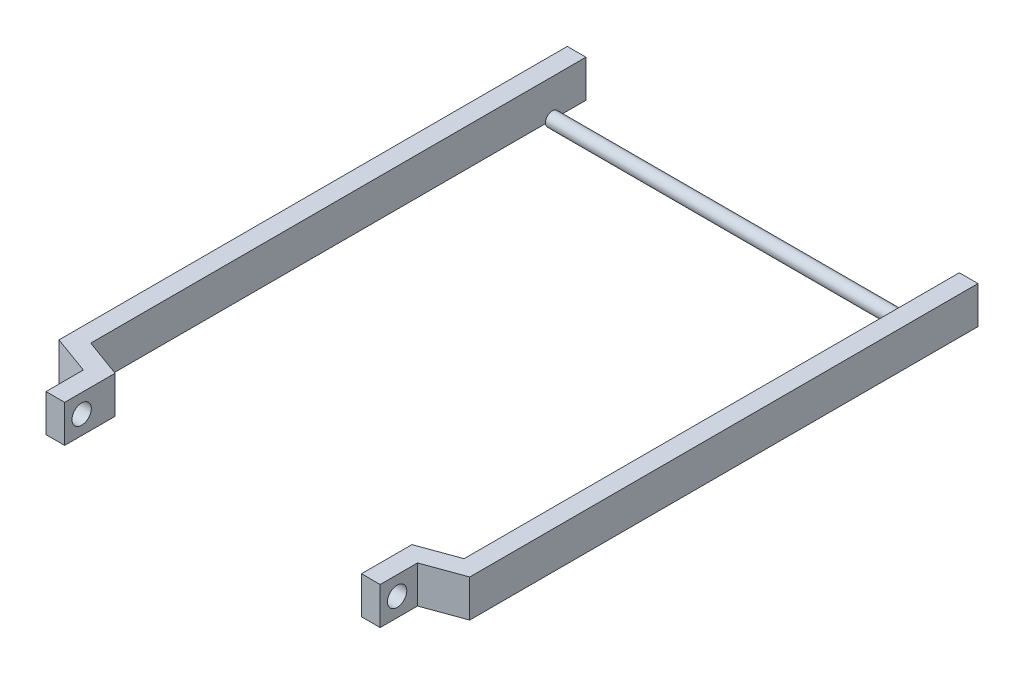
ISO-10303-21;
HEADER;
FILE_DESCRIPTION(('STEP AP214'),'2;1');
FILE_NAME('part.step','',(''),(''),'','','');
FILE_SCHEMA(('AUTOMOTIVE_DESIGN { 1 0 10303 214 1 1 1 1 }'));
ENDSEC;
DATA;
#1=APPLICATION_CONTEXT('core data for automotive mechanical design processes');
#2=APPLICATION_PROTOCOL_DEFINITION('international standard','automotive_design',2000,#1);
#3=PRODUCT_CONTEXT('',#1,'mechanical');
#4=PRODUCT('Part','Part','',(#3));
#5=PRODUCT_RELATED_PRODUCT_CATEGORY('part','',(#4));
#6=PRODUCT_DEFINITION_FORMATION('','',#4);
#7=PRODUCT_DEFINITION_CONTEXT('part definition',#1,'design');
#8=PRODUCT_DEFINITION('design','',#6,#7);
#9=PRODUCT_DEFINITION_SHAPE('','',#8);
#10=(LENGTH_UNIT() NAMED_UNIT(*) SI_UNIT(.MILLI.,.METRE.));
#11=(NAMED_UNIT(*) PLANE_ANGLE_UNIT() SI_UNIT($,.RADIAN.));
#12=(NAMED_UNIT(*) SI_UNIT($,.STERADIAN.) SOLID_ANGLE_UNIT());
#13=UNCERTAINTY_MEASURE_WITH_UNIT(LENGTH_MEASURE(1.E-05),#10,'distance_accuracy_value','');
#14=(GEOMETRIC_REPRESENTATION_CONTEXT(3) GLOBAL_UNCERTAINTY_ASSIGNED_CONTEXT((#13)) GLOBAL_UNIT_ASSIGNED_CONTEXT((#10,
#11,#12)) REPRESENTATION_CONTEXT('',''));
#15=CARTESIAN_POINT('',(0.,0.,0.));
#16=DIRECTION('',(0.,0.,1.));
#17=DIRECTION('',(1.,0.,0.));
#18=AXIS2_PLACEMENT_3D('',#15,#16,#17);
#19=CARTESIAN_POINT('',(-179.,40.,70.4038086206276));
#20=DIRECTION('',(1.,0.,0.));
#21=DIRECTION('',(0.,1.,0.));
#22=AXIS2_PLACEMENT_3D('',#19,#20,#21);
#23=PLANE('',#22);
#24=CARTESIAN_POINT('',(-179.,20.,92.2251137006805));
#25=DIRECTION('',(-1.,0.,0.));
#26=DIRECTION('',(0.,0.,1.));
#27=AXIS2_PLACEMENT_3D('',#24,#25,#26);
#28=CIRCLE('',#27,10.3434411603419);
#29=CARTESIAN_POINT('',(-179.,20.,102.568554861022));
#30=VERTEX_POINT('',#29);
#31=EDGE_CURVE('E168',#30,#30,#28,.T.);
#32=ORIENTED_EDGE('',*,*,#31,.F.);
#33=EDGE_LOOP('',(#32));
#34=FACE_BOUND('',#33,.T.);
#35=DIRECTION('',(0.,1.,0.));
#36=VECTOR('',#35,1.);
#37=CARTESIAN_POINT('',(-179.,40.,110.403808620628));
#38=LINE('',#37,#36);
#39=CARTESIAN_POINT('',(-179.,0.,110.403808620628));
#40=VERTEX_POINT('',#39);
#41=CARTESIAN_POINT('',(-179.,40.,110.403808620628));
#42=VERTEX_POINT('',#41);
#43=EDGE_CURVE('E12',#40,#42,#38,.T.);
#44=ORIENTED_EDGE('',*,*,#43,.T.);
#45=DIRECTION('',(0.,0.,1.));
#46=VECTOR('',#45,1.);
#47=CARTESIAN_POINT('',(-179.,40.,0.));
#48=LINE('',#47,#46);
#49=CARTESIAN_POINT('',(-179.,40.,70.4038086206276));
#50=VERTEX_POINT('',#49);
#51=EDGE_CURVE('E148',#50,#42,#48,.T.);
#52=ORIENTED_EDGE('',*,*,#51,.F.);
#53=DIRECTION('',(0.,-1.,0.));
#54=VECTOR('',#53,1.);
#55=CARTESIAN_POINT('',(-179.,40.,70.4038086206276));
#56=LINE('',#55,#54);
#57=CARTESIAN_POINT('',(-179.,0.,70.4038086206276));
#58=VERTEX_POINT('',#57);
#59=EDGE_CURVE('E213',#50,#58,#56,.T.);
#60=ORIENTED_EDGE('',*,*,#59,.T.);
#61=DIRECTION('',(0.,0.,1.));
#62=VECTOR('',#61,1.);
#63=CARTESIAN_POINT('',(-179.,0.,0.));
#64=LINE('',#63,#62);
#65=EDGE_CURVE('E206',#58,#40,#64,.T.);
#66=ORIENTED_EDGE('',*,*,#65,.T.);
#67=EDGE_LOOP('',(#44,#52,#60,#66));
#68=FACE_BOUND('',#67,.T.);
#69=ADVANCED_FACE('F57',(#34,#68),#23,.F.);
#70=CARTESIAN_POINT('',(-179.,40.,110.403808620628));
#71=DIRECTION('',(0.,0.,-1.));
#72=DIRECTION('',(0.,-1.,0.));
#73=AXIS2_PLACEMENT_3D('',#70,#71,#72);
#74=PLANE('',#73);
#75=DIRECTION('',(0.,1.,0.));
#76=VECTOR('',#75,1.);
#77=CARTESIAN_POINT('',(-159.,40.,110.403808620628));
#78=LINE('',#77,#76);
#79=CARTESIAN_POINT('',(-159.,0.,110.403808620628));
#80=VERTEX_POINT('',#79);
#81=CARTESIAN_POINT('',(-159.,40.,110.403808620628));
#82=VERTEX_POINT('',#81);
#83=EDGE_CURVE('E66',#80,#82,#78,.T.);
#84=ORIENTED_EDGE('',*,*,#83,.T.);
#85=DIRECTION('',(1.,0.,0.));
#86=VECTOR('',#85,1.);
#87=CARTESIAN_POINT('',(0.,40.,110.403808620628));
#88=LINE('',#87,#86);
#89=EDGE_CURVE('E200',#42,#82,#88,.T.);
#90=ORIENTED_EDGE('',*,*,#89,.F.);
#91=ORIENTED_EDGE('',*,*,#43,.F.);
#92=DIRECTION('',(1.,0.,0.));
#93=VECTOR('',#92,1.);
#94=CARTESIAN_POINT('',(0.,0.,110.403808620628));
#95=LINE('',#94,#93);
#96=EDGE_CURVE('E194',#40,#80,#95,.T.);
#97=ORIENTED_EDGE('',*,*,#96,.T.);
#98=EDGE_LOOP('',(#84,#90,#91,#97));
#99=FACE_BOUND('',#98,.T.);
#100=ADVANCED_FACE('F59',(#99),#74,.F.);
#101=CARTESIAN_POINT('',(-159.,40.,110.403808620628));
#102=DIRECTION('',(-1.,0.,0.));
#103=DIRECTION('',(0.,1.,0.));
#104=AXIS2_PLACEMENT_3D('',#101,#102,#103);
#105=PLANE('',#104);
#106=CARTESIAN_POINT('',(-159.,20.,92.2251137006804));
#107=DIRECTION('',(1.,0.,0.));
#108=DIRECTION('',(0.,0.,1.));
#109=AXIS2_PLACEMENT_3D('',#106,#107,#108);
#110=CIRCLE('',#109,10.3434411603419);
#111=CARTESIAN_POINT('',(-159.,20.,102.568554861022));
#112=VERTEX_POINT('',#111);
#113=EDGE_CURVE('E163',#112,#112,#110,.T.);
#114=ORIENTED_EDGE('',*,*,#113,.F.);
#115=EDGE_LOOP('',(#114));
#116=FACE_BOUND('',#115,.T.);
#117=DIRECTION('',(0.,1.,0.));
#118=VECTOR('',#117,1.);
#119=CARTESIAN_POINT('',(-159.,40.,56.3996578564334));
#120=LINE('',#119,#118);
#121=CARTESIAN_POINT('',(-159.,0.,56.3996578564334));
#122=VERTEX_POINT('',#121);
#123=CARTESIAN_POINT('',(-159.,40.,56.3996578564334));
#124=VERTEX_POINT('',#123);
#125=EDGE_CURVE('E228',#122,#124,#120,.T.);
#126=ORIENTED_EDGE('',*,*,#125,.T.);
#127=DIRECTION('',(0.,0.,-1.));
#128=VECTOR('',#127,1.);
#129=CARTESIAN_POINT('',(-159.,40.,0.));
#130=LINE('',#129,#128);
#131=EDGE_CURVE('E222',#82,#124,#130,.T.);
#132=ORIENTED_EDGE('',*,*,#131,.F.);
#133=ORIENTED_EDGE('',*,*,#83,.F.);
#134=DIRECTION('',(0.,0.,-1.));
#135=VECTOR('',#134,1.);
#136=CARTESIAN_POINT('',(-159.,0.,0.));
#137=LINE('',#136,#135);
#138=EDGE_CURVE('E184',#80,#122,#137,.T.);
#139=ORIENTED_EDGE('',*,*,#138,.T.);
#140=EDGE_LOOP('',(#126,#132,#133,#139));
#141=FACE_BOUND('',#140,.T.);
#142=ADVANCED_FACE('F266',(#116,#141),#105,.F.);
#143=CARTESIAN_POINT('',(-159.,40.,56.3996578564334));
#144=DIRECTION('',(-0.342020143325665,0.,0.939692620785909));
#145=DIRECTION('',(0.,1.,0.));
#146=AXIS2_PLACEMENT_3D('',#143,#144,#145);
#147=PLANE('',#146);
#148=DIRECTION('',(0.,1.,0.));
#149=VECTOR('',#148,1.);
#150=CARTESIAN_POINT('',(-200.,40.,41.4768782515192));
#151=LINE('',#150,#149);
#152=CARTESIAN_POINT('',(-200.,0.,41.4768782515192));
#153=VERTEX_POINT('',#152);
#154=CARTESIAN_POINT('',(-200.,40.,41.4768782515192));
#155=VERTEX_POINT('',#154);
#156=EDGE_CURVE('E225',#153,#155,#151,.T.);
#157=ORIENTED_EDGE('',*,*,#156,.T.);
#158=DIRECTION('',(-0.93969262078591,0.,-0.342020143325665));
#159=VECTOR('',#158,1.);
#160=CARTESIAN_POINT('',(-159.,40.,56.3996578564334));
#161=LINE('',#160,#159);
#162=EDGE_CURVE('E144',#124,#155,#161,.T.);
#163=ORIENTED_EDGE('',*,*,#162,.F.);
#164=ORIENTED_EDGE('',*,*,#125,.F.);
#165=DIRECTION('',(-0.93969262078591,0.,-0.342020143325665));
#166=VECTOR('',#165,1.);
#167=CARTESIAN_POINT('',(-159.,0.,56.3996578564334));
#168=LINE('',#167,#166);
#169=EDGE_CURVE('E181',#122,#153,#168,.T.);
#170=ORIENTED_EDGE('',*,*,#169,.T.);
#171=EDGE_LOOP('',(#157,#163,#164,#170));
#172=FACE_BOUND('',#171,.T.);
#173=ADVANCED_FACE('F271',(#172),#147,.F.);
#174=CARTESIAN_POINT('',(-200.,40.,41.4768782515192));
#175=DIRECTION('',(-1.,0.,0.));
#176=DIRECTION('',(0.,0.,1.));
#177=AXIS2_PLACEMENT_3D('',#174,#175,#176);
#178=PLANE('',#177);
#179=DIRECTION('',(0.,0.,-1.));
#180=VECTOR('',#179,1.);
#181=CARTESIAN_POINT('',(-200.,0.,0.));
#182=LINE('',#181,#180);
#183=CARTESIAN_POINT('',(-200.,0.,-489.071592309949));
#184=VERTEX_POINT('',#183);
#185=EDGE_CURVE('E161',#153,#184,#182,.T.);
#186=ORIENTED_EDGE('',*,*,#185,.T.);
#187=DIRECTION('',(0.,-1.,0.));
#188=VECTOR('',#187,1.);
#189=CARTESIAN_POINT('',(-200.,40.,-489.071592309949));
#190=LINE('',#189,#188);
#191=CARTESIAN_POINT('',(-200.,40.,-489.071592309949));
#192=VERTEX_POINT('',#191);
#193=EDGE_CURVE('E155',#192,#184,#190,.T.);
#194=ORIENTED_EDGE('',*,*,#193,.F.);
#195=DIRECTION('',(0.,0.,-1.));
#196=VECTOR('',#195,1.);
#197=CARTESIAN_POINT('',(-200.,40.,0.));
#198=LINE('',#197,#196);
#199=EDGE_CURVE('E138',#155,#192,#198,.T.);
#200=ORIENTED_EDGE('',*,*,#199,.F.);
#201=ORIENTED_EDGE('',*,*,#156,.F.);
#202=EDGE_LOOP('',(#186,#194,#200,#201));
#203=FACE_BOUND('',#202,.T.);
#204=ADVANCED_FACE('F159',(#203),#178,.F.);
#205=CARTESIAN_POINT('',(0.,40.,0.));
#206=DIRECTION('',(0.,1.,0.));
#207=DIRECTION('',(1.,0.,0.));
#208=AXIS2_PLACEMENT_3D('',#205,#206,#207);
#209=PLANE('',#208);
#210=ORIENTED_EDGE('',*,*,#199,.T.);
#211=DIRECTION('',(1.,0.,0.));
#212=VECTOR('',#211,1.);
#213=CARTESIAN_POINT('',(-200.,40.,-489.071592309949));
#214=LINE('',#213,#212);
#215=CARTESIAN_POINT('',(-220.,40.,-489.071592309949));
#216=VERTEX_POINT('',#215);
#217=EDGE_CURVE('E141',#216,#192,#214,.T.);
#218=ORIENTED_EDGE('',*,*,#217,.F.);
#219=DIRECTION('',(0.,0.,1.));
#220=VECTOR('',#219,1.);
#221=CARTESIAN_POINT('',(-220.,40.,-449.596191379372));
#222=LINE('',#221,#220);
#223=CARTESIAN_POINT('',(-220.,40.,55.4810290157135));
#224=VERTEX_POINT('',#223);
#225=EDGE_CURVE('E173',#216,#224,#222,.T.);
#226=ORIENTED_EDGE('',*,*,#225,.T.);
#227=DIRECTION('',(0.93969262078591,0.,0.342020143325665));
#228=VECTOR('',#227,1.);
#229=CARTESIAN_POINT('',(-220.,40.,55.4810290157135));
#230=LINE('',#229,#228);
#231=EDGE_CURVE('E203',#224,#50,#230,.T.);
#232=ORIENTED_EDGE('',*,*,#231,.T.);
#233=ORIENTED_EDGE('',*,*,#51,.T.);
#234=ORIENTED_EDGE('',*,*,#89,.T.);
#235=ORIENTED_EDGE('',*,*,#131,.T.);
#236=ORIENTED_EDGE('',*,*,#162,.T.);
#237=EDGE_LOOP('',(#210,#218,#226,#232,#233,#234,#235,#236));
#238=FACE_BOUND('',#237,.T.);
#239=ADVANCED_FACE('F140',(#238),#209,.T.);
#240=CARTESIAN_POINT('',(-220.,40.,55.4810290157135));
#241=DIRECTION('',(0.342020143325665,0.,-0.93969262078591));
#242=DIRECTION('',(0.,-1.,0.));
#243=AXIS2_PLACEMENT_3D('',#240,#241,#242);
#244=PLANE('',#243);
#245=ORIENTED_EDGE('',*,*,#59,.F.);
#246=ORIENTED_EDGE('',*,*,#231,.F.);
#247=DIRECTION('',(0.,-1.,0.));
#248=VECTOR('',#247,1.);
#249=CARTESIAN_POINT('',(-220.,40.,55.4810290157136));
#250=LINE('',#249,#248);
#251=CARTESIAN_POINT('',(-220.,0.,55.4810290157135));
#252=VERTEX_POINT('',#251);
#253=EDGE_CURVE('E177',#224,#252,#250,.T.);
#254=ORIENTED_EDGE('',*,*,#253,.T.);
#255=DIRECTION('',(0.93969262078591,0.,0.342020143325665));
#256=VECTOR('',#255,1.);
#257=CARTESIAN_POINT('',(-220.,0.,55.4810290157135));
#258=LINE('',#257,#256);
#259=EDGE_CURVE('E209',#252,#58,#258,.T.);
#260=ORIENTED_EDGE('',*,*,#259,.T.);
#261=EDGE_LOOP('',(#245,#246,#254,#260));
#262=FACE_BOUND('',#261,.T.);
#263=ADVANCED_FACE('F247',(#262),#244,.F.);
#264=CARTESIAN_POINT('',(0.,0.,0.));
#265=DIRECTION('',(0.,1.,0.));
#266=DIRECTION('',(1.,0.,0.));
#267=AXIS2_PLACEMENT_3D('',#264,#265,#266);
#268=PLANE('',#267);
#269=DIRECTION('',(0.,0.,-1.));
#270=VECTOR('',#269,1.);
#271=CARTESIAN_POINT('',(-220.,0.,-449.596191379372));
#272=LINE('',#271,#270);
#273=CARTESIAN_POINT('',(-220.,0.,-489.071592309949));
#274=VERTEX_POINT('',#273);
#275=EDGE_CURVE('E176',#252,#274,#272,.T.);
#276=ORIENTED_EDGE('',*,*,#275,.T.);
#277=DIRECTION('',(-1.,0.,0.));
#278=VECTOR('',#277,1.);
#279=CARTESIAN_POINT('',(-200.,0.,-489.071592309949));
#280=LINE('',#279,#278);
#281=EDGE_CURVE('E164',#184,#274,#280,.T.);
#282=ORIENTED_EDGE('',*,*,#281,.F.);
#283=ORIENTED_EDGE('',*,*,#185,.F.);
#284=ORIENTED_EDGE('',*,*,#169,.F.);
#285=ORIENTED_EDGE('',*,*,#138,.F.);
#286=ORIENTED_EDGE('',*,*,#96,.F.);
#287=ORIENTED_EDGE('',*,*,#65,.F.);
#288=ORIENTED_EDGE('',*,*,#259,.F.);
#289=EDGE_LOOP('',(#276,#282,#283,#284,#285,#286,#287,#288));
#290=FACE_BOUND('',#289,.T.);
#291=ADVANCED_FACE('F241',(#290),#268,.F.);
#292=CARTESIAN_POINT('',(-220.,40.,-449.596191379372));
#293=DIRECTION('',(1.,0.,0.));
#294=DIRECTION('',(0.,0.,-1.));
#295=AXIS2_PLACEMENT_3D('',#292,#293,#294);
#296=PLANE('',#295);
#297=ORIENTED_EDGE('',*,*,#225,.F.);
#298=DIRECTION('',(0.,1.,0.));
#299=VECTOR('',#298,1.);
#300=CARTESIAN_POINT('',(-220.,40.,-489.071592309949));
#301=LINE('',#300,#299);
#302=EDGE_CURVE('E157',#274,#216,#301,.T.);
#303=ORIENTED_EDGE('',*,*,#302,.F.);
#304=ORIENTED_EDGE('',*,*,#275,.F.);
#305=ORIENTED_EDGE('',*,*,#253,.F.);
#306=EDGE_LOOP('',(#297,#303,#304,#305));
#307=FACE_BOUND('',#306,.T.);
#308=ADVANCED_FACE('F246',(#307),#296,.F.);
#309=CARTESIAN_POINT('',(248.,20.,92.2251137006804));
#310=DIRECTION('',(-1.,0.,0.));
#311=DIRECTION('',(0.,0.,1.));
#312=AXIS2_PLACEMENT_3D('',#309,#310,#311);
#313=CYLINDRICAL_SURFACE('',#312,10.3434411603419);
#314=ORIENTED_EDGE('',*,*,#31,.T.);
#315=EDGE_LOOP('',(#314));
#316=FACE_BOUND('',#315,.T.);
#317=ORIENTED_EDGE('',*,*,#113,.T.);
#318=EDGE_LOOP('',(#317));
#319=FACE_BOUND('',#318,.T.);
#320=ADVANCED_FACE('F256',(#316,#319),#313,.F.);
#321=CARTESIAN_POINT('',(0.,0.,-489.071592309949));
#322=DIRECTION('',(0.,0.,-1.));
#323=DIRECTION('',(-1.,0.,0.));
#324=AXIS2_PLACEMENT_3D('',#321,#322,#323);
#325=PLANE('',#324);
#326=ORIENTED_EDGE('',*,*,#193,.T.);
#327=ORIENTED_EDGE('',*,*,#281,.T.);
#328=ORIENTED_EDGE('',*,*,#302,.T.);
#329=ORIENTED_EDGE('',*,*,#217,.T.);
#330=EDGE_LOOP('',(#326,#327,#328,#329));
#331=FACE_BOUND('',#330,.T.);
#332=ADVANCED_FACE('F153',(#331),#325,.T.);
#333=CLOSED_SHELL('',(#69,#100,#142,#173,#204,#239,#263,#291,#308,#320,#332));
#334=MANIFOLD_SOLID_BREP('B2',#333);
#335=CARTESIAN_POINT('',(200.,40.,41.4768782515192));
#336=DIRECTION('',(1.,0.,0.));
#337=DIRECTION('',(0.,1.,0.));
#338=AXIS2_PLACEMENT_3D('',#335,#336,#337);
#339=PLANE('',#338);
#340=CARTESIAN_POINT('',(200.,2.90200286857897,-450.955888488416));
#341=DIRECTION('',(-1.,0.,0.));
#342=DIRECTION('',(0.,0.,1.));
#343=AXIS2_PLACEMENT_3D('',#340,#341,#342);
#344=CIRCLE('',#343,7.3522689366653);
#345=CARTESIAN_POINT('',(200.,0.,-444.200576662319));
#346=VERTEX_POINT('',#345);
#347=CARTESIAN_POINT('',(200.,0.,-457.711200314514));
#348=VERTEX_POINT('',#347);
#349=EDGE_CURVE('E602',#346,#348,#344,.T.);
#350=ORIENTED_EDGE('',*,*,#349,.F.);
#351=DIRECTION('',(0.,0.,-1.));
#352=VECTOR('',#351,1.);
#353=CARTESIAN_POINT('',(200.,0.,0.));
#354=LINE('',#353,#352);
#355=CARTESIAN_POINT('',(200.,0.,41.4768782515192));
#356=VERTEX_POINT('',#355);
#357=EDGE_CURVE('E596',#356,#346,#354,.T.);
#358=ORIENTED_EDGE('',*,*,#357,.F.);
#359=DIRECTION('',(0.,1.,0.));
#360=VECTOR('',#359,1.);
#361=CARTESIAN_POINT('',(200.,40.,41.4768782515192));
#362=LINE('',#361,#360);
#363=CARTESIAN_POINT('',(200.,40.,41.4768782515192));
#364=VERTEX_POINT('',#363);
#365=EDGE_CURVE('E643',#356,#364,#362,.T.);
#366=ORIENTED_EDGE('',*,*,#365,.T.);
#367=DIRECTION('',(0.,0.,-1.));
#368=VECTOR('',#367,1.);
#369=CARTESIAN_POINT('',(200.,40.,0.));
#370=LINE('',#369,#368);
#371=CARTESIAN_POINT('',(200.,40.,-489.071592309949));
#372=VERTEX_POINT('',#371);
#373=EDGE_CURVE('E657',#364,#372,#370,.T.);
#374=ORIENTED_EDGE('',*,*,#373,.T.);
#375=DIRECTION('',(0.,1.,0.));
#376=VECTOR('',#375,1.);
#377=CARTESIAN_POINT('',(200.,40.,-489.071592309949));
#378=LINE('',#377,#376);
#379=CARTESIAN_POINT('',(200.,0.,-489.071592309949));
#380=VERTEX_POINT('',#379);
#381=EDGE_CURVE('E720',#380,#372,#378,.T.);
#382=ORIENTED_EDGE('',*,*,#381,.F.);
#383=EDGE_CURVE('E597',#348,#380,#354,.T.);
#384=ORIENTED_EDGE('',*,*,#383,.F.);
#385=EDGE_LOOP('',(#350,#358,#366,#374,#382,#384));
#386=FACE_BOUND('',#385,.T.);
#387=ADVANCED_FACE('F506',(#386),#339,.F.);
#388=CARTESIAN_POINT('',(179.,40.,70.4038086206276));
#389=DIRECTION('',(-1.,0.,0.));
#390=DIRECTION('',(0.,0.,1.));
#391=AXIS2_PLACEMENT_3D('',#388,#389,#390);
#392=PLANE('',#391);
#393=CARTESIAN_POINT('',(179.,20.,92.2251137006804));
#394=DIRECTION('',(1.,0.,0.));
#395=DIRECTION('',(0.,0.,1.));
#396=AXIS2_PLACEMENT_3D('',#393,#394,#395);
#397=CIRCLE('',#396,10.3434411603419);
#398=CARTESIAN_POINT('',(179.,20.,102.568554861022));
#399=VERTEX_POINT('',#398);
#400=EDGE_CURVE('E711',#399,#399,#397,.T.);
#401=ORIENTED_EDGE('',*,*,#400,.F.);
#402=EDGE_LOOP('',(#401));
#403=FACE_BOUND('',#402,.T.);
#404=DIRECTION('',(0.,1.,0.));
#405=VECTOR('',#404,1.);
#406=CARTESIAN_POINT('',(179.,40.,70.4038086206276));
#407=LINE('',#406,#405);
#408=CARTESIAN_POINT('',(179.,0.,70.4038086206276));
#409=VERTEX_POINT('',#408);
#410=CARTESIAN_POINT('',(179.,40.,70.4038086206276));
#411=VERTEX_POINT('',#410);
#412=EDGE_CURVE('E534',#409,#411,#407,.T.);
#413=ORIENTED_EDGE('',*,*,#412,.T.);
#414=DIRECTION('',(0.,0.,1.));
#415=VECTOR('',#414,1.);
#416=CARTESIAN_POINT('',(179.,40.,0.));
#417=LINE('',#416,#415);
#418=CARTESIAN_POINT('',(179.,40.,110.403808620628));
#419=VERTEX_POINT('',#418);
#420=EDGE_CURVE('E672',#411,#419,#417,.T.);
#421=ORIENTED_EDGE('',*,*,#420,.T.);
#422=DIRECTION('',(0.,-1.,0.));
#423=VECTOR('',#422,1.);
#424=CARTESIAN_POINT('',(179.,40.,110.403808620628));
#425=LINE('',#424,#423);
#426=CARTESIAN_POINT('',(179.,0.,110.403808620628));
#427=VERTEX_POINT('',#426);
#428=EDGE_CURVE('E55',#419,#427,#425,.T.);
#429=ORIENTED_EDGE('',*,*,#428,.T.);
#430=DIRECTION('',(0.,0.,1.));
#431=VECTOR('',#430,1.);
#432=CARTESIAN_POINT('',(179.,0.,0.));
#433=LINE('',#432,#431);
#434=EDGE_CURVE('E621',#409,#427,#433,.T.);
#435=ORIENTED_EDGE('',*,*,#434,.F.);
#436=EDGE_LOOP('',(#413,#421,#429,#435));
#437=FACE_BOUND('',#436,.T.);
#438=ADVANCED_FACE('F508',(#403,#437),#392,.F.);
#439=CARTESIAN_POINT('',(179.,40.,110.403808620628));
#440=DIRECTION('',(0.,0.,-1.));
#441=DIRECTION('',(0.,-1.,0.));
#442=AXIS2_PLACEMENT_3D('',#439,#440,#441);
#443=PLANE('',#442);
#444=ORIENTED_EDGE('',*,*,#428,.F.);
#445=DIRECTION('',(-1.,0.,0.));
#446=VECTOR('',#445,1.);
#447=CARTESIAN_POINT('',(0.,40.,110.403808620628));
#448=LINE('',#447,#446);
#449=CARTESIAN_POINT('',(159.,40.,110.403808620628));
#450=VERTEX_POINT('',#449);
#451=EDGE_CURVE('E668',#419,#450,#448,.T.);
#452=ORIENTED_EDGE('',*,*,#451,.T.);
#453=DIRECTION('',(0.,-1.,0.));
#454=VECTOR('',#453,1.);
#455=CARTESIAN_POINT('',(159.,40.,110.403808620628));
#456=LINE('',#455,#454);
#457=CARTESIAN_POINT('',(159.,0.,110.403808620628));
#458=VERTEX_POINT('',#457);
#459=EDGE_CURVE('E515',#450,#458,#456,.T.);
#460=ORIENTED_EDGE('',*,*,#459,.T.);
#461=DIRECTION('',(-1.,0.,0.));
#462=VECTOR('',#461,1.);
#463=CARTESIAN_POINT('',(0.,0.,110.403808620628));
#464=LINE('',#463,#462);
#465=EDGE_CURVE('E652',#427,#458,#464,.T.);
#466=ORIENTED_EDGE('',*,*,#465,.F.);
#467=EDGE_LOOP('',(#444,#452,#460,#466));
#468=FACE_BOUND('',#467,.T.);
#469=ADVANCED_FACE('F699',(#468),#443,.F.);
#470=CARTESIAN_POINT('',(159.,40.,110.403808620628));
#471=DIRECTION('',(1.,0.,0.));
#472=DIRECTION('',(0.,0.,1.));
#473=AXIS2_PLACEMENT_3D('',#470,#471,#472);
#474=PLANE('',#473);
#475=CARTESIAN_POINT('',(159.,20.,92.2251137006804));
#476=DIRECTION('',(-1.,0.,0.));
#477=DIRECTION('',(0.,0.,1.));
#478=AXIS2_PLACEMENT_3D('',#475,#476,#477);
#479=CIRCLE('',#478,10.3434411603419);
#480=CARTESIAN_POINT('',(159.,20.,102.568554861022));
#481=VERTEX_POINT('',#480);
#482=EDGE_CURVE('E640',#481,#481,#479,.T.);
#483=ORIENTED_EDGE('',*,*,#482,.F.);
#484=EDGE_LOOP('',(#483));
#485=FACE_BOUND('',#484,.T.);
#486=ORIENTED_EDGE('',*,*,#459,.F.);
#487=DIRECTION('',(0.,0.,-1.));
#488=VECTOR('',#487,1.);
#489=CARTESIAN_POINT('',(159.,40.,0.));
#490=LINE('',#489,#488);
#491=CARTESIAN_POINT('',(159.,40.,56.3996578564334));
#492=VERTEX_POINT('',#491);
#493=EDGE_CURVE('E664',#450,#492,#490,.T.);
#494=ORIENTED_EDGE('',*,*,#493,.T.);
#495=DIRECTION('',(0.,-1.,0.));
#496=VECTOR('',#495,1.);
#497=CARTESIAN_POINT('',(159.,40.,56.3996578564334));
#498=LINE('',#497,#496);
#499=CARTESIAN_POINT('',(159.,0.,56.3996578564334));
#500=VERTEX_POINT('',#499);
#501=EDGE_CURVE('E677',#492,#500,#498,.T.);
#502=ORIENTED_EDGE('',*,*,#501,.T.);
#503=DIRECTION('',(0.,0.,-1.));
#504=VECTOR('',#503,1.);
#505=CARTESIAN_POINT('',(159.,0.,0.));
#506=LINE('',#505,#504);
#507=EDGE_CURVE('E629',#458,#500,#506,.T.);
#508=ORIENTED_EDGE('',*,*,#507,.F.);
#509=EDGE_LOOP('',(#486,#494,#502,#508));
#510=FACE_BOUND('',#509,.T.);
#511=ADVANCED_FACE('F695',(#485,#510),#474,.F.);
#512=CARTESIAN_POINT('',(159.,40.,56.3996578564334));
#513=DIRECTION('',(0.342020143325665,0.,0.939692620785909));
#514=DIRECTION('',(0.,-1.,0.));
#515=AXIS2_PLACEMENT_3D('',#512,#513,#514);
#516=PLANE('',#515);
#517=ORIENTED_EDGE('',*,*,#501,.F.);
#518=DIRECTION('',(0.93969262078591,0.,-0.342020143325665));
#519=VECTOR('',#518,1.);
#520=CARTESIAN_POINT('',(159.,40.,56.3996578564334));
#521=LINE('',#520,#519);
#522=EDGE_CURVE('E656',#492,#364,#521,.T.);
#523=ORIENTED_EDGE('',*,*,#522,.T.);
#524=ORIENTED_EDGE('',*,*,#365,.F.);
#525=DIRECTION('',(0.93969262078591,0.,-0.342020143325665));
#526=VECTOR('',#525,1.);
#527=CARTESIAN_POINT('',(159.,0.,56.3996578564334));
#528=LINE('',#527,#526);
#529=EDGE_CURVE('E613',#500,#356,#528,.T.);
#530=ORIENTED_EDGE('',*,*,#529,.F.);
#531=EDGE_LOOP('',(#517,#523,#524,#530));
#532=FACE_BOUND('',#531,.T.);
#533=ADVANCED_FACE('F692',(#532),#516,.F.);
#534=CARTESIAN_POINT('',(220.,40.,55.4810290157135));
#535=DIRECTION('',(-0.342020143325665,0.,-0.93969262078591));
#536=DIRECTION('',(-0.93969262078591,0.,0.342020143325665));
#537=AXIS2_PLACEMENT_3D('',#534,#535,#536);
#538=PLANE('',#537);
#539=DIRECTION('',(0.,1.,0.));
#540=VECTOR('',#539,1.);
#541=CARTESIAN_POINT('',(220.,40.,55.4810290157136));
#542=LINE('',#541,#540);
#543=CARTESIAN_POINT('',(220.,0.,55.4810290157135));
#544=VERTEX_POINT('',#543);
#545=CARTESIAN_POINT('',(220.,40.,55.4810290157135));
#546=VERTEX_POINT('',#545);
#547=EDGE_CURVE('E644',#544,#546,#542,.T.);
#548=ORIENTED_EDGE('',*,*,#547,.T.);
#549=DIRECTION('',(-0.93969262078591,0.,0.342020143325665));
#550=VECTOR('',#549,1.);
#551=CARTESIAN_POINT('',(220.,40.,55.4810290157135));
#552=LINE('',#551,#550);
#553=EDGE_CURVE('E660',#546,#411,#552,.T.);
#554=ORIENTED_EDGE('',*,*,#553,.T.);
#555=ORIENTED_EDGE('',*,*,#412,.F.);
#556=DIRECTION('',(-0.93969262078591,0.,0.342020143325665));
#557=VECTOR('',#556,1.);
#558=CARTESIAN_POINT('',(220.,0.,55.4810290157135));
#559=LINE('',#558,#557);
#560=EDGE_CURVE('E615',#544,#409,#559,.T.);
#561=ORIENTED_EDGE('',*,*,#560,.F.);
#562=EDGE_LOOP('',(#548,#554,#555,#561));
#563=FACE_BOUND('',#562,.T.);
#564=ADVANCED_FACE('F823',(#563),#538,.F.);
#565=CARTESIAN_POINT('',(0.,40.,0.));
#566=DIRECTION('',(0.,-1.,0.));
#567=DIRECTION('',(0.,0.,-1.));
#568=AXIS2_PLACEMENT_3D('',#565,#566,#567);
#569=PLANE('',#568);
#570=DIRECTION('',(0.,0.,-1.));
#571=VECTOR('',#570,1.);
#572=CARTESIAN_POINT('',(220.,40.,-449.596191379372));
#573=LINE('',#572,#571);
#574=CARTESIAN_POINT('',(220.,40.,-489.071592309949));
#575=VERTEX_POINT('',#574);
#576=EDGE_CURVE('E647',#546,#575,#573,.T.);
#577=ORIENTED_EDGE('',*,*,#576,.T.);
#578=DIRECTION('',(1.,0.,0.));
#579=VECTOR('',#578,1.);
#580=CARTESIAN_POINT('',(220.,40.,-489.071592309949));
#581=LINE('',#580,#579);
#582=EDGE_CURVE('E691',#372,#575,#581,.T.);
#583=ORIENTED_EDGE('',*,*,#582,.F.);
#584=ORIENTED_EDGE('',*,*,#373,.F.);
#585=ORIENTED_EDGE('',*,*,#522,.F.);
#586=ORIENTED_EDGE('',*,*,#493,.F.);
#587=ORIENTED_EDGE('',*,*,#451,.F.);
#588=ORIENTED_EDGE('',*,*,#420,.F.);
#589=ORIENTED_EDGE('',*,*,#553,.F.);
#590=EDGE_LOOP('',(#577,#583,#584,#585,#586,#587,#588,#589));
#591=FACE_BOUND('',#590,.T.);
#592=ADVANCED_FACE('F688',(#591),#569,.F.);
#593=CARTESIAN_POINT('',(0.,0.,0.));
#594=DIRECTION('',(0.,-1.,0.));
#595=DIRECTION('',(0.,0.,-1.));
#596=AXIS2_PLACEMENT_3D('',#593,#594,#595);
#597=PLANE('',#596);
#598=ORIENTED_EDGE('',*,*,#357,.T.);
#599=EDGE_CURVE('E591',#346,#348,#354,.T.);
#600=ORIENTED_EDGE('',*,*,#599,.T.);
#601=ORIENTED_EDGE('',*,*,#383,.T.);
#602=DIRECTION('',(-1.,0.,0.));
#603=VECTOR('',#602,1.);
#604=CARTESIAN_POINT('',(220.,0.,-489.071592309949));
#605=LINE('',#604,#603);
#606=CARTESIAN_POINT('',(220.,0.,-489.071592309949));
#607=VERTEX_POINT('',#606);
#608=EDGE_CURVE('E989',#607,#380,#605,.T.);
#609=ORIENTED_EDGE('',*,*,#608,.F.);
#610=DIRECTION('',(0.,0.,1.));
#611=VECTOR('',#610,1.);
#612=CARTESIAN_POINT('',(220.,0.,-449.596191379372));
#613=LINE('',#612,#611);
#614=EDGE_CURVE('E636',#607,#544,#613,.T.);
#615=ORIENTED_EDGE('',*,*,#614,.T.);
#616=ORIENTED_EDGE('',*,*,#560,.T.);
#617=ORIENTED_EDGE('',*,*,#434,.T.);
#618=ORIENTED_EDGE('',*,*,#465,.T.);
#619=ORIENTED_EDGE('',*,*,#507,.T.);
#620=ORIENTED_EDGE('',*,*,#529,.T.);
#621=EDGE_LOOP('',(#598,#600,#601,#609,#615,#616,#617,#618,#619,#620));
#622=FACE_BOUND('',#621,.T.);
#623=ADVANCED_FACE('F610',(#622),#597,.T.);
#624=CARTESIAN_POINT('',(220.,40.,-449.596191379372));
#625=DIRECTION('',(-1.,0.,0.));
#626=DIRECTION('',(0.,0.,1.));
#627=AXIS2_PLACEMENT_3D('',#624,#625,#626);
#628=PLANE('',#627);
#629=ORIENTED_EDGE('',*,*,#614,.F.);
#630=DIRECTION('',(0.,-1.,0.));
#631=VECTOR('',#630,1.);
#632=CARTESIAN_POINT('',(220.,40.,-489.071592309949));
#633=LINE('',#632,#631);
#634=EDGE_CURVE('E986',#575,#607,#633,.T.);
#635=ORIENTED_EDGE('',*,*,#634,.F.);
#636=ORIENTED_EDGE('',*,*,#576,.F.);
#637=ORIENTED_EDGE('',*,*,#547,.F.);
#638=EDGE_LOOP('',(#629,#635,#636,#637));
#639=FACE_BOUND('',#638,.T.);
#640=ADVANCED_FACE('F740',(#639),#628,.F.);
#641=CARTESIAN_POINT('',(248.,20.,92.2251137006804));
#642=DIRECTION('',(-1.,0.,0.));
#643=DIRECTION('',(0.,0.,1.));
#644=AXIS2_PLACEMENT_3D('',#641,#642,#643);
#645=CYLINDRICAL_SURFACE('',#644,10.3434411603419);
#646=ORIENTED_EDGE('',*,*,#482,.T.);
#647=EDGE_LOOP('',(#646));
#648=FACE_BOUND('',#647,.T.);
#649=ORIENTED_EDGE('',*,*,#400,.T.);
#650=EDGE_LOOP('',(#649));
#651=FACE_BOUND('',#650,.T.);
#652=ADVANCED_FACE('F734',(#648,#651),#645,.F.);
#653=CARTESIAN_POINT('',(0.,0.,-489.071592309949));
#654=DIRECTION('',(0.,0.,-1.));
#655=DIRECTION('',(-1.,0.,0.));
#656=AXIS2_PLACEMENT_3D('',#653,#654,#655);
#657=PLANE('',#656);
#658=ORIENTED_EDGE('',*,*,#634,.T.);
#659=ORIENTED_EDGE('',*,*,#608,.T.);
#660=ORIENTED_EDGE('',*,*,#381,.T.);
#661=ORIENTED_EDGE('',*,*,#582,.T.);
#662=EDGE_LOOP('',(#658,#659,#660,#661));
#663=FACE_BOUND('',#662,.T.);
#664=ADVANCED_FACE('F739',(#663),#657,.T.);
#665=CARTESIAN_POINT('',(-198.,2.90200286857897,-450.955888488416));
#666=DIRECTION('',(1.,0.,0.));
#667=DIRECTION('',(0.,0.,-1.));
#668=AXIS2_PLACEMENT_3D('',#665,#666,#667);
#669=CYLINDRICAL_SURFACE('',#668,7.3522689366653);
#670=CARTESIAN_POINT('',(-198.,2.90200286857897,-450.955888488416));
#671=DIRECTION('',(-1.,0.,0.));
#672=DIRECTION('',(0.,0.,1.));
#673=AXIS2_PLACEMENT_3D('',#670,#671,#672);
#674=CIRCLE('',#673,7.3522689366653);
#675=CARTESIAN_POINT('',(-198.,2.90200286857897,-443.603619551751));
#676=VERTEX_POINT('',#675);
#677=EDGE_CURVE('E604',#676,#676,#674,.T.);
#678=ORIENTED_EDGE('',*,*,#677,.F.);
#679=EDGE_LOOP('',(#678));
#680=FACE_BOUND('',#679,.T.);
#681=EDGE_CURVE('E521',#348,#346,#344,.T.);
#682=ORIENTED_EDGE('',*,*,#681,.T.);
#683=ORIENTED_EDGE('',*,*,#349,.T.);
#684=EDGE_LOOP('',(#682,#683));
#685=FACE_BOUND('',#684,.T.);
#686=ADVANCED_FACE('F601',(#680,#685),#669,.T.);
#687=CARTESIAN_POINT('',(-198.,2.90200286857897,-450.955888488416));
#688=DIRECTION('',(-1.,0.,0.));
#689=DIRECTION('',(0.,0.,1.));
#690=AXIS2_PLACEMENT_3D('',#687,#688,#689);
#691=PLANE('',#690);
#692=ORIENTED_EDGE('',*,*,#677,.T.);
#693=EDGE_LOOP('',(#692));
#694=FACE_BOUND('',#693,.T.);
#695=ADVANCED_FACE('F942',(#694),#691,.T.);
#696=CARTESIAN_POINT('',(200.,2.90200286857897,-450.955888488416));
#697=DIRECTION('',(-1.,0.,0.));
#698=DIRECTION('',(0.,0.,1.));
#699=AXIS2_PLACEMENT_3D('',#696,#697,#698);
#700=PLANE('',#699);
#701=ORIENTED_EDGE('',*,*,#599,.F.);
#702=ORIENTED_EDGE('',*,*,#681,.F.);
#703=EDGE_LOOP('',(#701,#702));
#704=FACE_BOUND('',#703,.T.);
#705=ADVANCED_FACE('F592',(#704),#700,.F.);
#706=CLOSED_SHELL('',(#387,#438,#469,#511,#533,#564,#592,#623,#640,#652,#664,#686,#695,#705));
#707=MANIFOLD_SOLID_BREP('B6',#706);
#708=ADVANCED_BREP_SHAPE_REPRESENTATION('',(#18,#334,#707),#14);
#709=SHAPE_DEFINITION_REPRESENTATION(#9,#708);
ENDSEC;
END-ISO-10303-21;
